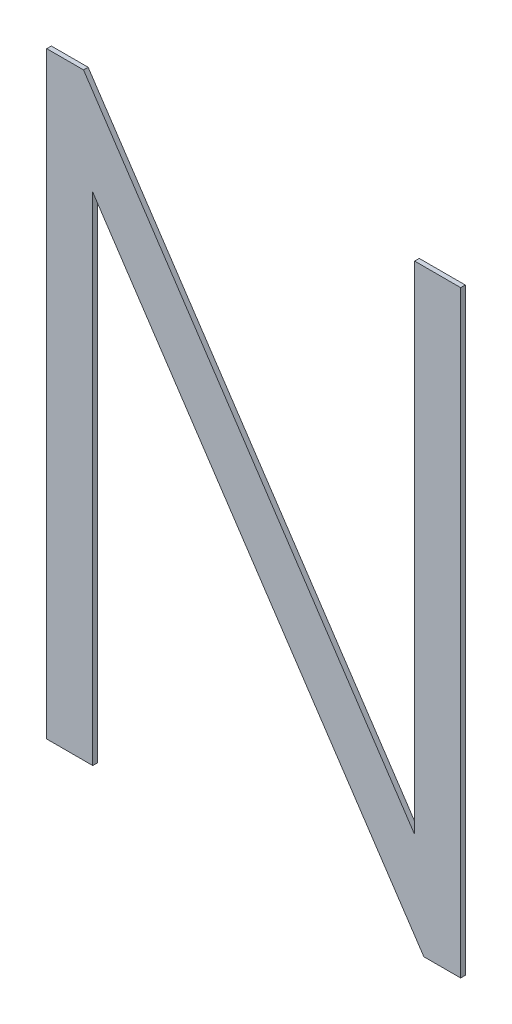
ISO-10303-21;
HEADER;
FILE_DESCRIPTION(('STEP AP214'),'2;1');
FILE_NAME('part.step','',(''),(''),'','','');
FILE_SCHEMA(('AUTOMOTIVE_DESIGN { 1 0 10303 214 1 1 1 1 }'));
ENDSEC;
DATA;
#1=APPLICATION_CONTEXT('core data for automotive mechanical design processes');
#2=APPLICATION_PROTOCOL_DEFINITION('international standard','automotive_design',2000,#1);
#3=PRODUCT_CONTEXT('',#1,'mechanical');
#4=PRODUCT('Part','Part','',(#3));
#5=PRODUCT_RELATED_PRODUCT_CATEGORY('part','',(#4));
#6=PRODUCT_DEFINITION_FORMATION('','',#4);
#7=PRODUCT_DEFINITION_CONTEXT('part definition',#1,'design');
#8=PRODUCT_DEFINITION('design','',#6,#7);
#9=PRODUCT_DEFINITION_SHAPE('','',#8);
#10=(LENGTH_UNIT() NAMED_UNIT(*) SI_UNIT(.MILLI.,.METRE.));
#11=(NAMED_UNIT(*) PLANE_ANGLE_UNIT() SI_UNIT($,.RADIAN.));
#12=(NAMED_UNIT(*) SI_UNIT($,.STERADIAN.) SOLID_ANGLE_UNIT());
#13=UNCERTAINTY_MEASURE_WITH_UNIT(LENGTH_MEASURE(1.E-05),#10,'distance_accuracy_value','');
#14=(GEOMETRIC_REPRESENTATION_CONTEXT(3) GLOBAL_UNCERTAINTY_ASSIGNED_CONTEXT((#13)) GLOBAL_UNIT_ASSIGNED_CONTEXT((#10,
#11,#12)) REPRESENTATION_CONTEXT('',''));
#15=CARTESIAN_POINT('',(0.,0.,0.));
#16=DIRECTION('',(0.,0.,1.));
#17=DIRECTION('',(1.,0.,0.));
#18=AXIS2_PLACEMENT_3D('',#15,#16,#17);
#19=CARTESIAN_POINT('',(-0.4499991,-0.6499987,0.01));
#20=DIRECTION('',(0.,0.,-1.));
#21=DIRECTION('',(-1.,0.,0.));
#22=AXIS2_PLACEMENT_3D('',#19,#20,#21);
#23=PLANE('',#22);
#24=DIRECTION('',(0.,1.,0.));
#25=VECTOR('',#24,1.);
#26=CARTESIAN_POINT('',(-0.3499993,-0.6499987,0.01));
#27=LINE('',#26,#25);
#28=CARTESIAN_POINT('',(-0.3499993,-0.6499987,0.01));
#29=VERTEX_POINT('',#28);
#30=CARTESIAN_POINT('',(-0.3499993,0.43000168,0.01));
#31=VERTEX_POINT('',#30);
#32=EDGE_CURVE('E136',#29,#31,#27,.T.);
#33=ORIENTED_EDGE('',*,*,#32,.T.);
#34=DIRECTION('',(-0.554699293058979,0.832050896447969,0.));
#35=VECTOR('',#34,1.);
#36=CARTESIAN_POINT('',(-0.3499993,0.43000168,0.01));
#37=LINE('',#36,#35);
#38=CARTESIAN_POINT('',(0.369999260000038,-0.649998699999975,0.01));
#39=VERTEX_POINT('',#38);
#40=EDGE_CURVE('E132',#31,#39,#37,.F.);
#41=ORIENTED_EDGE('',*,*,#40,.T.);
#42=DIRECTION('',(1.,0.,0.));
#43=VECTOR('',#42,1.);
#44=CARTESIAN_POINT('',(0.36999926,-0.6499987,0.01));
#45=LINE('',#44,#43);
#46=CARTESIAN_POINT('',(0.4499991,-0.6499987,0.01));
#47=VERTEX_POINT('',#46);
#48=EDGE_CURVE('E128',#39,#47,#45,.T.);
#49=ORIENTED_EDGE('',*,*,#48,.T.);
#50=DIRECTION('',(0.,1.,0.));
#51=VECTOR('',#50,1.);
#52=CARTESIAN_POINT('',(0.4499991,-0.6499987,0.01));
#53=LINE('',#52,#51);
#54=CARTESIAN_POINT('',(0.4499991,0.65000124,0.01));
#55=VERTEX_POINT('',#54);
#56=EDGE_CURVE('E124',#47,#55,#53,.T.);
#57=ORIENTED_EDGE('',*,*,#56,.T.);
#58=DIRECTION('',(1.,0.,0.));
#59=VECTOR('',#58,1.);
#60=CARTESIAN_POINT('',(0.4499991,0.65000124,0.01));
#61=LINE('',#60,#59);
#62=CARTESIAN_POINT('',(0.3499993,0.65000124,0.01));
#63=VERTEX_POINT('',#62);
#64=EDGE_CURVE('E120',#55,#63,#61,.F.);
#65=ORIENTED_EDGE('',*,*,#64,.T.);
#66=DIRECTION('',(0.,1.,0.));
#67=VECTOR('',#66,1.);
#68=CARTESIAN_POINT('',(0.3499993,0.65000124,0.01));
#69=LINE('',#68,#67);
#70=CARTESIAN_POINT('',(0.3499993,-0.4299966,0.01));
#71=VERTEX_POINT('',#70);
#72=EDGE_CURVE('E116',#63,#71,#69,.F.);
#73=ORIENTED_EDGE('',*,*,#72,.T.);
#74=DIRECTION('',(0.554700196224998,-0.832050294337997,0.));
#75=VECTOR('',#74,1.);
#76=CARTESIAN_POINT('',(0.3499993,-0.4299966,0.01));
#77=LINE('',#76,#75);
#78=CARTESIAN_POINT('',(-0.369999259999925,0.65000124000005,0.01));
#79=VERTEX_POINT('',#78);
#80=EDGE_CURVE('E92',#71,#79,#77,.F.);
#81=ORIENTED_EDGE('',*,*,#80,.T.);
#82=DIRECTION('',(1.,0.,0.));
#83=VECTOR('',#82,1.);
#84=CARTESIAN_POINT('',(-0.36999926,0.65000124,0.01));
#85=LINE('',#84,#83);
#86=CARTESIAN_POINT('',(-0.4499991,0.65000124,0.01));
#87=VERTEX_POINT('',#86);
#88=EDGE_CURVE('E94',#79,#87,#85,.F.);
#89=ORIENTED_EDGE('',*,*,#88,.T.);
#90=DIRECTION('',(0.,1.,0.));
#91=VECTOR('',#90,1.);
#92=CARTESIAN_POINT('',(-0.4499991,0.65000124,0.01));
#93=LINE('',#92,#91);
#94=CARTESIAN_POINT('',(-0.4499991,-0.6499987,0.01));
#95=VERTEX_POINT('',#94);
#96=EDGE_CURVE('E20',#87,#95,#93,.F.);
#97=ORIENTED_EDGE('',*,*,#96,.T.);
#98=DIRECTION('',(1.,0.,0.));
#99=VECTOR('',#98,1.);
#100=CARTESIAN_POINT('',(-0.4499991,-0.6499987,0.01));
#101=LINE('',#100,#99);
#102=EDGE_CURVE('E141',#95,#29,#101,.T.);
#103=ORIENTED_EDGE('',*,*,#102,.T.);
#104=EDGE_LOOP('',(#33,#41,#49,#57,#65,#73,#81,#89,#97,#103));
#105=FACE_BOUND('',#104,.T.);
#106=ADVANCED_FACE('F17',(#105),#23,.F.);
#107=CARTESIAN_POINT('',(-0.4499991,0.65000124,0.));
#108=DIRECTION('',(1.,0.,0.));
#109=DIRECTION('',(0.,0.,-1.));
#110=AXIS2_PLACEMENT_3D('',#107,#108,#109);
#111=PLANE('',#110);
#112=DIRECTION('',(0.,0.,1.));
#113=VECTOR('',#112,1.);
#114=CARTESIAN_POINT('',(-0.4499991,-0.6499987,0.));
#115=LINE('',#114,#113);
#116=CARTESIAN_POINT('',(-0.4499991,-0.6499987,0.));
#117=VERTEX_POINT('',#116);
#118=EDGE_CURVE('E105',#117,#95,#115,.T.);
#119=ORIENTED_EDGE('',*,*,#118,.T.);
#120=ORIENTED_EDGE('',*,*,#96,.F.);
#121=DIRECTION('',(0.,0.,-1.));
#122=VECTOR('',#121,1.);
#123=CARTESIAN_POINT('',(-0.4499991,0.65000124,0.));
#124=LINE('',#123,#122);
#125=CARTESIAN_POINT('',(-0.4499991,0.65000124,0.));
#126=VERTEX_POINT('',#125);
#127=EDGE_CURVE('E100',#87,#126,#124,.T.);
#128=ORIENTED_EDGE('',*,*,#127,.T.);
#129=DIRECTION('',(0.,1.,0.));
#130=VECTOR('',#129,1.);
#131=CARTESIAN_POINT('',(-0.4499991,-0.6499987,0.));
#132=LINE('',#131,#130);
#133=EDGE_CURVE('E144',#117,#126,#132,.T.);
#134=ORIENTED_EDGE('',*,*,#133,.F.);
#135=EDGE_LOOP('',(#119,#120,#128,#134));
#136=FACE_BOUND('',#135,.T.);
#137=ADVANCED_FACE('F102',(#136),#111,.F.);
#138=CARTESIAN_POINT('',(-0.36999926,0.65000124,0.));
#139=DIRECTION('',(0.,-1.,0.));
#140=DIRECTION('',(0.,0.,-1.));
#141=AXIS2_PLACEMENT_3D('',#138,#139,#140);
#142=PLANE('',#141);
#143=ORIENTED_EDGE('',*,*,#127,.F.);
#144=ORIENTED_EDGE('',*,*,#88,.F.);
#145=DIRECTION('',(0.,0.,1.));
#146=VECTOR('',#145,1.);
#147=CARTESIAN_POINT('',(-0.3699992599997,0.6500012400002,0.));
#148=LINE('',#147,#146);
#149=CARTESIAN_POINT('',(-0.369999259999925,0.65000124000005,0.));
#150=VERTEX_POINT('',#149);
#151=EDGE_CURVE('E112',#79,#150,#148,.F.);
#152=ORIENTED_EDGE('',*,*,#151,.T.);
#153=DIRECTION('',(-1.,0.,0.));
#154=VECTOR('',#153,1.);
#155=CARTESIAN_POINT('',(-0.4499991,0.65000124,0.));
#156=LINE('',#155,#154);
#157=EDGE_CURVE('E109',#126,#150,#156,.F.);
#158=ORIENTED_EDGE('',*,*,#157,.F.);
#159=EDGE_LOOP('',(#143,#144,#152,#158));
#160=FACE_BOUND('',#159,.T.);
#161=ADVANCED_FACE('F107',(#160),#142,.F.);
#162=CARTESIAN_POINT('',(0.3499993,-0.4299966,0.));
#163=DIRECTION('',(-0.832050294337997,-0.554700196224998,0.));
#164=DIRECTION('',(0.554700196224998,-0.832050294337997,0.));
#165=AXIS2_PLACEMENT_3D('',#162,#163,#164);
#166=PLANE('',#165);
#167=ORIENTED_EDGE('',*,*,#151,.F.);
#168=ORIENTED_EDGE('',*,*,#80,.F.);
#169=DIRECTION('',(0.,0.,-1.));
#170=VECTOR('',#169,1.);
#171=CARTESIAN_POINT('',(0.3499993,-0.4299966,0.));
#172=LINE('',#171,#170);
#173=CARTESIAN_POINT('',(0.3499993,-0.4299966,0.));
#174=VERTEX_POINT('',#173);
#175=EDGE_CURVE('E118',#71,#174,#172,.T.);
#176=ORIENTED_EDGE('',*,*,#175,.T.);
#177=DIRECTION('',(0.554700196225229,-0.832050294337844,0.));
#178=VECTOR('',#177,1.);
#179=CARTESIAN_POINT('',(-0.36999926,0.65000124,0.));
#180=LINE('',#179,#178);
#181=EDGE_CURVE('E147',#150,#174,#180,.T.);
#182=ORIENTED_EDGE('',*,*,#181,.F.);
#183=EDGE_LOOP('',(#167,#168,#176,#182));
#184=FACE_BOUND('',#183,.T.);
#185=ADVANCED_FACE('F196',(#184),#166,.F.);
#186=CARTESIAN_POINT('',(0.3499993,0.65000124,0.));
#187=DIRECTION('',(1.,0.,0.));
#188=DIRECTION('',(0.,0.,-1.));
#189=AXIS2_PLACEMENT_3D('',#186,#187,#188);
#190=PLANE('',#189);
#191=ORIENTED_EDGE('',*,*,#175,.F.);
#192=ORIENTED_EDGE('',*,*,#72,.F.);
#193=DIRECTION('',(0.,0.,-1.));
#194=VECTOR('',#193,1.);
#195=CARTESIAN_POINT('',(0.3499993,0.65000124,0.));
#196=LINE('',#195,#194);
#197=CARTESIAN_POINT('',(0.3499993,0.65000124,0.));
#198=VERTEX_POINT('',#197);
#199=EDGE_CURVE('E122',#63,#198,#196,.T.);
#200=ORIENTED_EDGE('',*,*,#199,.T.);
#201=DIRECTION('',(0.,1.,0.));
#202=VECTOR('',#201,1.);
#203=CARTESIAN_POINT('',(0.3499993,-0.6499987,0.));
#204=LINE('',#203,#202);
#205=EDGE_CURVE('E150',#174,#198,#204,.T.);
#206=ORIENTED_EDGE('',*,*,#205,.F.);
#207=EDGE_LOOP('',(#191,#192,#200,#206));
#208=FACE_BOUND('',#207,.T.);
#209=ADVANCED_FACE('F194',(#208),#190,.F.);
#210=CARTESIAN_POINT('',(0.4499991,0.65000124,0.));
#211=DIRECTION('',(0.,-1.,0.));
#212=DIRECTION('',(0.,0.,-1.));
#213=AXIS2_PLACEMENT_3D('',#210,#211,#212);
#214=PLANE('',#213);
#215=ORIENTED_EDGE('',*,*,#199,.F.);
#216=ORIENTED_EDGE('',*,*,#64,.F.);
#217=DIRECTION('',(0.,0.,1.));
#218=VECTOR('',#217,1.);
#219=CARTESIAN_POINT('',(0.4499991,0.65000124,0.));
#220=LINE('',#219,#218);
#221=CARTESIAN_POINT('',(0.4499991,0.65000124,0.));
#222=VERTEX_POINT('',#221);
#223=EDGE_CURVE('E126',#55,#222,#220,.F.);
#224=ORIENTED_EDGE('',*,*,#223,.T.);
#225=DIRECTION('',(-1.,0.,0.));
#226=VECTOR('',#225,1.);
#227=CARTESIAN_POINT('',(-0.4499991,0.65000124,0.));
#228=LINE('',#227,#226);
#229=EDGE_CURVE('E153',#198,#222,#228,.F.);
#230=ORIENTED_EDGE('',*,*,#229,.F.);
#231=EDGE_LOOP('',(#215,#216,#224,#230));
#232=FACE_BOUND('',#231,.T.);
#233=ADVANCED_FACE('F189',(#232),#214,.F.);
#234=CARTESIAN_POINT('',(0.4499991,-0.6499987,0.));
#235=DIRECTION('',(-1.,0.,0.));
#236=DIRECTION('',(0.,0.,1.));
#237=AXIS2_PLACEMENT_3D('',#234,#235,#236);
#238=PLANE('',#237);
#239=ORIENTED_EDGE('',*,*,#223,.F.);
#240=ORIENTED_EDGE('',*,*,#56,.F.);
#241=DIRECTION('',(0.,0.,1.));
#242=VECTOR('',#241,1.);
#243=CARTESIAN_POINT('',(0.4499991,-0.6499987,0.));
#244=LINE('',#243,#242);
#245=CARTESIAN_POINT('',(0.4499991,-0.6499987,0.));
#246=VERTEX_POINT('',#245);
#247=EDGE_CURVE('E130',#47,#246,#244,.F.);
#248=ORIENTED_EDGE('',*,*,#247,.T.);
#249=DIRECTION('',(0.,1.,0.));
#250=VECTOR('',#249,1.);
#251=CARTESIAN_POINT('',(0.4499991,-0.6499987,0.));
#252=LINE('',#251,#250);
#253=EDGE_CURVE('E156',#222,#246,#252,.F.);
#254=ORIENTED_EDGE('',*,*,#253,.F.);
#255=EDGE_LOOP('',(#239,#240,#248,#254));
#256=FACE_BOUND('',#255,.T.);
#257=ADVANCED_FACE('F184',(#256),#238,.F.);
#258=CARTESIAN_POINT('',(0.36999926,-0.6499987,0.));
#259=DIRECTION('',(0.,1.,0.));
#260=DIRECTION('',(0.,0.,1.));
#261=AXIS2_PLACEMENT_3D('',#258,#259,#260);
#262=PLANE('',#261);
#263=ORIENTED_EDGE('',*,*,#247,.F.);
#264=ORIENTED_EDGE('',*,*,#48,.F.);
#265=DIRECTION('',(0.,0.,1.));
#266=VECTOR('',#265,1.);
#267=CARTESIAN_POINT('',(0.369999260000152,-0.649998699999899,0.));
#268=LINE('',#267,#266);
#269=CARTESIAN_POINT('',(0.369999260000038,-0.649998699999975,0.));
#270=VERTEX_POINT('',#269);
#271=EDGE_CURVE('E134',#39,#270,#268,.F.);
#272=ORIENTED_EDGE('',*,*,#271,.T.);
#273=DIRECTION('',(-1.,0.,0.));
#274=VECTOR('',#273,1.);
#275=CARTESIAN_POINT('',(-0.4499991,-0.6499987,0.));
#276=LINE('',#275,#274);
#277=EDGE_CURVE('E159',#246,#270,#276,.T.);
#278=ORIENTED_EDGE('',*,*,#277,.F.);
#279=EDGE_LOOP('',(#263,#264,#272,#278));
#280=FACE_BOUND('',#279,.T.);
#281=ADVANCED_FACE('F179',(#280),#262,.F.);
#282=CARTESIAN_POINT('',(-0.3499993,0.43000168,0.));
#283=DIRECTION('',(0.832050896447969,0.554699293058979,0.));
#284=DIRECTION('',(-0.554699293058979,0.832050896447969,0.));
#285=AXIS2_PLACEMENT_3D('',#282,#283,#284);
#286=PLANE('',#285);
#287=ORIENTED_EDGE('',*,*,#271,.F.);
#288=ORIENTED_EDGE('',*,*,#40,.F.);
#289=DIRECTION('',(0.,0.,1.));
#290=VECTOR('',#289,1.);
#291=CARTESIAN_POINT('',(-0.3499993,0.43000168,0.));
#292=LINE('',#291,#290);
#293=CARTESIAN_POINT('',(-0.3499993,0.43000168,0.));
#294=VERTEX_POINT('',#293);
#295=EDGE_CURVE('E138',#31,#294,#292,.F.);
#296=ORIENTED_EDGE('',*,*,#295,.T.);
#297=DIRECTION('',(-0.554699293058862,0.832050896448047,0.));
#298=VECTOR('',#297,1.);
#299=CARTESIAN_POINT('',(0.36999926,-0.6499987,0.));
#300=LINE('',#299,#298);
#301=EDGE_CURVE('E162',#270,#294,#300,.T.);
#302=ORIENTED_EDGE('',*,*,#301,.F.);
#303=EDGE_LOOP('',(#287,#288,#296,#302));
#304=FACE_BOUND('',#303,.T.);
#305=ADVANCED_FACE('F174',(#304),#286,.F.);
#306=CARTESIAN_POINT('',(-0.3499993,-0.6499987,0.));
#307=DIRECTION('',(-1.,0.,0.));
#308=DIRECTION('',(0.,0.,1.));
#309=AXIS2_PLACEMENT_3D('',#306,#307,#308);
#310=PLANE('',#309);
#311=ORIENTED_EDGE('',*,*,#295,.F.);
#312=ORIENTED_EDGE('',*,*,#32,.F.);
#313=DIRECTION('',(0.,0.,1.));
#314=VECTOR('',#313,1.);
#315=CARTESIAN_POINT('',(-0.3499993,-0.6499987,0.));
#316=LINE('',#315,#314);
#317=CARTESIAN_POINT('',(-0.3499993,-0.6499987,0.));
#318=VERTEX_POINT('',#317);
#319=EDGE_CURVE('E35',#29,#318,#316,.F.);
#320=ORIENTED_EDGE('',*,*,#319,.T.);
#321=DIRECTION('',(0.,1.,0.));
#322=VECTOR('',#321,1.);
#323=CARTESIAN_POINT('',(-0.3499993,-0.6499987,0.));
#324=LINE('',#323,#322);
#325=EDGE_CURVE('E26',#294,#318,#324,.F.);
#326=ORIENTED_EDGE('',*,*,#325,.F.);
#327=EDGE_LOOP('',(#311,#312,#320,#326));
#328=FACE_BOUND('',#327,.T.);
#329=ADVANCED_FACE('F170',(#328),#310,.F.);
#330=CARTESIAN_POINT('',(-0.4499991,-0.6499987,0.));
#331=DIRECTION('',(0.,1.,0.));
#332=DIRECTION('',(0.,0.,1.));
#333=AXIS2_PLACEMENT_3D('',#330,#331,#332);
#334=PLANE('',#333);
#335=ORIENTED_EDGE('',*,*,#319,.F.);
#336=ORIENTED_EDGE('',*,*,#102,.F.);
#337=ORIENTED_EDGE('',*,*,#118,.F.);
#338=DIRECTION('',(-1.,0.,0.));
#339=VECTOR('',#338,1.);
#340=CARTESIAN_POINT('',(-0.4499991,-0.6499987,0.));
#341=LINE('',#340,#339);
#342=EDGE_CURVE('E11',#318,#117,#341,.T.);
#343=ORIENTED_EDGE('',*,*,#342,.F.);
#344=EDGE_LOOP('',(#335,#336,#337,#343));
#345=FACE_BOUND('',#344,.T.);
#346=ADVANCED_FACE('F199',(#345),#334,.F.);
#347=CARTESIAN_POINT('',(-0.4499991,-0.6499987,0.));
#348=DIRECTION('',(0.,0.,-1.));
#349=DIRECTION('',(-1.,0.,0.));
#350=AXIS2_PLACEMENT_3D('',#347,#348,#349);
#351=PLANE('',#350);
#352=ORIENTED_EDGE('',*,*,#325,.T.);
#353=ORIENTED_EDGE('',*,*,#342,.T.);
#354=ORIENTED_EDGE('',*,*,#133,.T.);
#355=ORIENTED_EDGE('',*,*,#157,.T.);
#356=ORIENTED_EDGE('',*,*,#181,.T.);
#357=ORIENTED_EDGE('',*,*,#205,.T.);
#358=ORIENTED_EDGE('',*,*,#229,.T.);
#359=ORIENTED_EDGE('',*,*,#253,.T.);
#360=ORIENTED_EDGE('',*,*,#277,.T.);
#361=ORIENTED_EDGE('',*,*,#301,.T.);
#362=EDGE_LOOP('',(#352,#353,#354,#355,#356,#357,#358,#359,#360,#361));
#363=FACE_BOUND('',#362,.T.);
#364=ADVANCED_FACE('F167',(#363),#351,.T.);
#365=CLOSED_SHELL('',(#106,#137,#161,#185,#209,#233,#257,#281,#305,#329,#346,#364));
#366=MANIFOLD_SOLID_BREP('B1',#365);
#367=ADVANCED_BREP_SHAPE_REPRESENTATION('',(#18,#366),#14);
#368=SHAPE_DEFINITION_REPRESENTATION(#9,#367);
ENDSEC;
END-ISO-10303-21;
